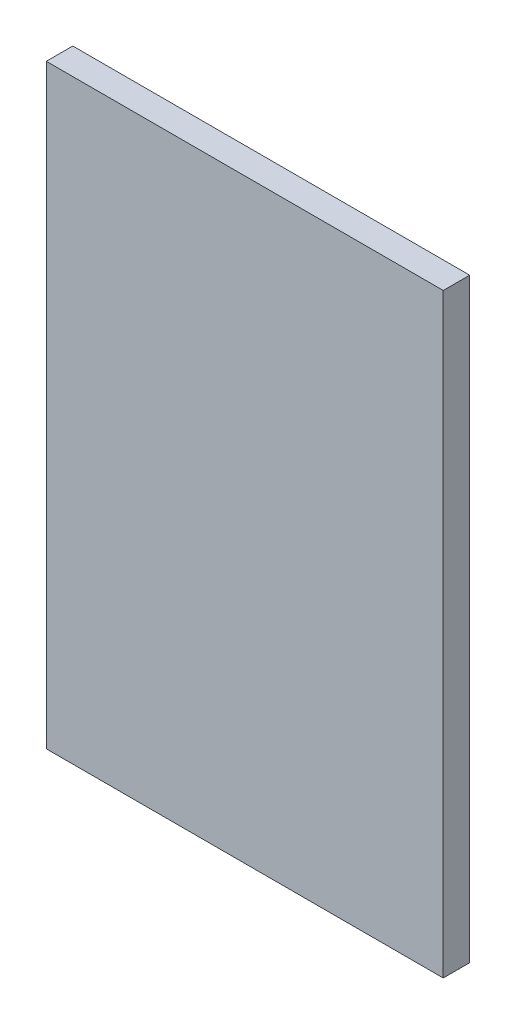
ISO-10303-21;
HEADER;
FILE_DESCRIPTION(('STEP AP214'),'2;1');
FILE_NAME('part.step','',(''),(''),'','','');
FILE_SCHEMA(('AUTOMOTIVE_DESIGN { 1 0 10303 214 1 1 1 1 }'));
ENDSEC;
DATA;
#1=APPLICATION_CONTEXT('core data for automotive mechanical design processes');
#2=APPLICATION_PROTOCOL_DEFINITION('international standard','automotive_design',2000,#1);
#3=PRODUCT_CONTEXT('',#1,'mechanical');
#4=PRODUCT('Part','Part','',(#3));
#5=PRODUCT_RELATED_PRODUCT_CATEGORY('part','',(#4));
#6=PRODUCT_DEFINITION_FORMATION('','',#4);
#7=PRODUCT_DEFINITION_CONTEXT('part definition',#1,'design');
#8=PRODUCT_DEFINITION('design','',#6,#7);
#9=PRODUCT_DEFINITION_SHAPE('','',#8);
#10=(LENGTH_UNIT() NAMED_UNIT(*) SI_UNIT(.MILLI.,.METRE.));
#11=(NAMED_UNIT(*) PLANE_ANGLE_UNIT() SI_UNIT($,.RADIAN.));
#12=(NAMED_UNIT(*) SI_UNIT($,.STERADIAN.) SOLID_ANGLE_UNIT());
#13=UNCERTAINTY_MEASURE_WITH_UNIT(LENGTH_MEASURE(1.E-05),#10,'distance_accuracy_value','');
#14=(GEOMETRIC_REPRESENTATION_CONTEXT(3) GLOBAL_UNCERTAINTY_ASSIGNED_CONTEXT((#13)) GLOBAL_UNIT_ASSIGNED_CONTEXT((#10,
#11,#12)) REPRESENTATION_CONTEXT('',''));
#15=CARTESIAN_POINT('',(0.,0.,0.));
#16=DIRECTION('',(0.,0.,1.));
#17=DIRECTION('',(1.,0.,0.));
#18=AXIS2_PLACEMENT_3D('',#15,#16,#17);
#19=CARTESIAN_POINT('',(0.,0.,-10.));
#20=DIRECTION('',(-1.,0.,0.));
#21=DIRECTION('',(0.,0.,1.));
#22=AXIS2_PLACEMENT_3D('',#19,#20,#21);
#23=PLANE('',#22);
#24=DIRECTION('',(0.,-1.,0.));
#25=VECTOR('',#24,1.);
#26=CARTESIAN_POINT('',(0.,0.,0.));
#27=LINE('',#26,#25);
#28=CARTESIAN_POINT('',(0.,225.,0.));
#29=VERTEX_POINT('',#28);
#30=CARTESIAN_POINT('',(0.,0.,0.));
#31=VERTEX_POINT('',#30);
#32=EDGE_CURVE('E96',#29,#31,#27,.T.);
#33=ORIENTED_EDGE('',*,*,#32,.F.);
#34=DIRECTION('',(0.,0.,1.));
#35=VECTOR('',#34,1.);
#36=CARTESIAN_POINT('',(0.,225.,-10.));
#37=LINE('',#36,#35);
#38=CARTESIAN_POINT('',(0.,225.,-10.));
#39=VERTEX_POINT('',#38);
#40=EDGE_CURVE('E11',#39,#29,#37,.T.);
#41=ORIENTED_EDGE('',*,*,#40,.F.);
#42=DIRECTION('',(0.,-1.,0.));
#43=VECTOR('',#42,1.);
#44=CARTESIAN_POINT('',(0.,0.,-10.));
#45=LINE('',#44,#43);
#46=CARTESIAN_POINT('',(0.,0.,-10.));
#47=VERTEX_POINT('',#46);
#48=EDGE_CURVE('E90',#39,#47,#45,.T.);
#49=ORIENTED_EDGE('',*,*,#48,.T.);
#50=DIRECTION('',(0.,0.,1.));
#51=VECTOR('',#50,1.);
#52=CARTESIAN_POINT('',(0.,0.,-10.));
#53=LINE('',#52,#51);
#54=EDGE_CURVE('E35',#47,#31,#53,.T.);
#55=ORIENTED_EDGE('',*,*,#54,.T.);
#56=EDGE_LOOP('',(#33,#41,#49,#55));
#57=FACE_BOUND('',#56,.T.);
#58=ADVANCED_FACE('F32',(#57),#23,.T.);
#59=CARTESIAN_POINT('',(0.,225.,-10.));
#60=DIRECTION('',(0.,1.,0.));
#61=DIRECTION('',(0.,0.,1.));
#62=AXIS2_PLACEMENT_3D('',#59,#60,#61);
#63=PLANE('',#62);
#64=DIRECTION('',(-1.,0.,0.));
#65=VECTOR('',#64,1.);
#66=CARTESIAN_POINT('',(0.,225.,0.));
#67=LINE('',#66,#65);
#68=CARTESIAN_POINT('',(150.,225.,0.));
#69=VERTEX_POINT('',#68);
#70=EDGE_CURVE('E92',#69,#29,#67,.T.);
#71=ORIENTED_EDGE('',*,*,#70,.F.);
#72=DIRECTION('',(0.,0.,1.));
#73=VECTOR('',#72,1.);
#74=CARTESIAN_POINT('',(150.,225.,-10.));
#75=LINE('',#74,#73);
#76=CARTESIAN_POINT('',(150.,225.,-10.));
#77=VERTEX_POINT('',#76);
#78=EDGE_CURVE('E41',#77,#69,#75,.T.);
#79=ORIENTED_EDGE('',*,*,#78,.F.);
#80=DIRECTION('',(-1.,0.,0.));
#81=VECTOR('',#80,1.);
#82=CARTESIAN_POINT('',(0.,225.,-10.));
#83=LINE('',#82,#81);
#84=EDGE_CURVE('E87',#77,#39,#83,.T.);
#85=ORIENTED_EDGE('',*,*,#84,.T.);
#86=ORIENTED_EDGE('',*,*,#40,.T.);
#87=EDGE_LOOP('',(#71,#79,#85,#86));
#88=FACE_BOUND('',#87,.T.);
#89=ADVANCED_FACE('F106',(#88),#63,.T.);
#90=CARTESIAN_POINT('',(150.,0.,-10.));
#91=DIRECTION('',(1.,0.,0.));
#92=DIRECTION('',(0.,0.,-1.));
#93=AXIS2_PLACEMENT_3D('',#90,#91,#92);
#94=PLANE('',#93);
#95=DIRECTION('',(0.,1.,0.));
#96=VECTOR('',#95,1.);
#97=CARTESIAN_POINT('',(150.,0.,0.));
#98=LINE('',#97,#96);
#99=CARTESIAN_POINT('',(150.,0.,0.));
#100=VERTEX_POINT('',#99);
#101=EDGE_CURVE('E82',#100,#69,#98,.T.);
#102=ORIENTED_EDGE('',*,*,#101,.F.);
#103=DIRECTION('',(0.,0.,1.));
#104=VECTOR('',#103,1.);
#105=CARTESIAN_POINT('',(150.,0.,-10.));
#106=LINE('',#105,#104);
#107=CARTESIAN_POINT('',(150.,0.,-10.));
#108=VERTEX_POINT('',#107);
#109=EDGE_CURVE('E77',#108,#100,#106,.T.);
#110=ORIENTED_EDGE('',*,*,#109,.F.);
#111=DIRECTION('',(0.,1.,0.));
#112=VECTOR('',#111,1.);
#113=CARTESIAN_POINT('',(150.,0.,-10.));
#114=LINE('',#113,#112);
#115=EDGE_CURVE('E80',#108,#77,#114,.T.);
#116=ORIENTED_EDGE('',*,*,#115,.T.);
#117=ORIENTED_EDGE('',*,*,#78,.T.);
#118=EDGE_LOOP('',(#102,#110,#116,#117));
#119=FACE_BOUND('',#118,.T.);
#120=ADVANCED_FACE('F79',(#119),#94,.T.);
#121=CARTESIAN_POINT('',(0.,0.,-10.));
#122=DIRECTION('',(0.,-1.,0.));
#123=DIRECTION('',(0.,0.,-1.));
#124=AXIS2_PLACEMENT_3D('',#121,#122,#123);
#125=PLANE('',#124);
#126=DIRECTION('',(1.,0.,0.));
#127=VECTOR('',#126,1.);
#128=CARTESIAN_POINT('',(0.,0.,0.));
#129=LINE('',#128,#127);
#130=EDGE_CURVE('E99',#31,#100,#129,.T.);
#131=ORIENTED_EDGE('',*,*,#130,.F.);
#132=ORIENTED_EDGE('',*,*,#54,.F.);
#133=DIRECTION('',(1.,0.,0.));
#134=VECTOR('',#133,1.);
#135=CARTESIAN_POINT('',(0.,0.,-10.));
#136=LINE('',#135,#134);
#137=EDGE_CURVE('E86',#47,#108,#136,.T.);
#138=ORIENTED_EDGE('',*,*,#137,.T.);
#139=ORIENTED_EDGE('',*,*,#109,.T.);
#140=EDGE_LOOP('',(#131,#132,#138,#139));
#141=FACE_BOUND('',#140,.T.);
#142=ADVANCED_FACE('F89',(#141),#125,.T.);
#143=CARTESIAN_POINT('',(0.,0.,-10.));
#144=DIRECTION('',(0.,0.,-1.));
#145=DIRECTION('',(-1.,0.,0.));
#146=AXIS2_PLACEMENT_3D('',#143,#144,#145);
#147=PLANE('',#146);
#148=ORIENTED_EDGE('',*,*,#48,.F.);
#149=ORIENTED_EDGE('',*,*,#84,.F.);
#150=ORIENTED_EDGE('',*,*,#115,.F.);
#151=ORIENTED_EDGE('',*,*,#137,.F.);
#152=EDGE_LOOP('',(#148,#149,#150,#151));
#153=FACE_BOUND('',#152,.T.);
#154=ADVANCED_FACE('F85',(#153),#147,.T.);
#155=CARTESIAN_POINT('',(0.,0.,0.));
#156=DIRECTION('',(0.,0.,-1.));
#157=DIRECTION('',(-1.,0.,0.));
#158=AXIS2_PLACEMENT_3D('',#155,#156,#157);
#159=PLANE('',#158);
#160=ORIENTED_EDGE('',*,*,#32,.T.);
#161=ORIENTED_EDGE('',*,*,#130,.T.);
#162=ORIENTED_EDGE('',*,*,#101,.T.);
#163=ORIENTED_EDGE('',*,*,#70,.T.);
#164=EDGE_LOOP('',(#160,#161,#162,#163));
#165=FACE_BOUND('',#164,.T.);
#166=ADVANCED_FACE('F105',(#165),#159,.F.);
#167=CLOSED_SHELL('',(#58,#89,#120,#142,#154,#166));
#168=MANIFOLD_SOLID_BREP('B2',#167);
#169=ADVANCED_BREP_SHAPE_REPRESENTATION('',(#18,#168),#14);
#170=SHAPE_DEFINITION_REPRESENTATION(#9,#169);
ENDSEC;
END-ISO-10303-21;
